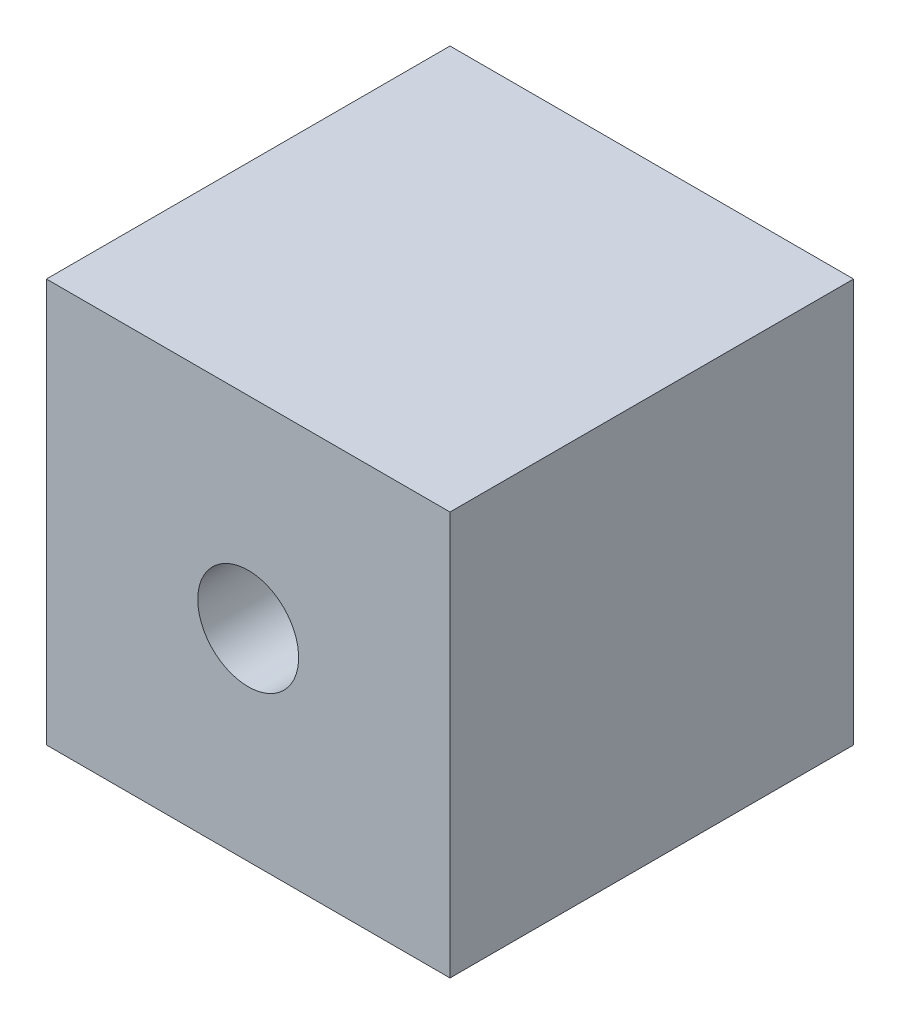
ISO-10303-21;
HEADER;
FILE_DESCRIPTION(('STEP AP214'),'2;1');
FILE_NAME('part.step','',(''),(''),'','','');
FILE_SCHEMA(('AUTOMOTIVE_DESIGN { 1 0 10303 214 1 1 1 1 }'));
ENDSEC;
DATA;
#1=APPLICATION_CONTEXT('core data for automotive mechanical design processes');
#2=APPLICATION_PROTOCOL_DEFINITION('international standard','automotive_design',2000,#1);
#3=PRODUCT_CONTEXT('',#1,'mechanical');
#4=PRODUCT('Part','Part','',(#3));
#5=PRODUCT_RELATED_PRODUCT_CATEGORY('part','',(#4));
#6=PRODUCT_DEFINITION_FORMATION('','',#4);
#7=PRODUCT_DEFINITION_CONTEXT('part definition',#1,'design');
#8=PRODUCT_DEFINITION('design','',#6,#7);
#9=PRODUCT_DEFINITION_SHAPE('','',#8);
#10=(LENGTH_UNIT() NAMED_UNIT(*) SI_UNIT(.MILLI.,.METRE.));
#11=(NAMED_UNIT(*) PLANE_ANGLE_UNIT() SI_UNIT($,.RADIAN.));
#12=(NAMED_UNIT(*) SI_UNIT($,.STERADIAN.) SOLID_ANGLE_UNIT());
#13=UNCERTAINTY_MEASURE_WITH_UNIT(LENGTH_MEASURE(1.E-05),#10,'distance_accuracy_value','');
#14=(GEOMETRIC_REPRESENTATION_CONTEXT(3) GLOBAL_UNCERTAINTY_ASSIGNED_CONTEXT((#13)) GLOBAL_UNIT_ASSIGNED_CONTEXT((#10,
#11,#12)) REPRESENTATION_CONTEXT('',''));
#15=CARTESIAN_POINT('',(0.,0.,0.));
#16=DIRECTION('',(0.,0.,1.));
#17=DIRECTION('',(1.,0.,0.));
#18=AXIS2_PLACEMENT_3D('',#15,#16,#17);
#19=CARTESIAN_POINT('',(30.,30.,30.));
#20=DIRECTION('',(-1.,0.,0.));
#21=DIRECTION('',(0.,-1.,0.));
#22=AXIS2_PLACEMENT_3D('',#19,#20,#21);
#23=PLANE('',#22);
#24=DIRECTION('',(0.,1.,0.));
#25=VECTOR('',#24,1.);
#26=CARTESIAN_POINT('',(30.,30.,-30.));
#27=LINE('',#26,#25);
#28=CARTESIAN_POINT('',(30.,-30.,-30.));
#29=VERTEX_POINT('',#28);
#30=CARTESIAN_POINT('',(30.,30.,-30.));
#31=VERTEX_POINT('',#30);
#32=EDGE_CURVE('E98',#29,#31,#27,.T.);
#33=ORIENTED_EDGE('',*,*,#32,.T.);
#34=DIRECTION('',(0.,0.,-1.));
#35=VECTOR('',#34,1.);
#36=CARTESIAN_POINT('',(30.,30.,30.));
#37=LINE('',#36,#35);
#38=CARTESIAN_POINT('',(30.,30.,30.));
#39=VERTEX_POINT('',#38);
#40=EDGE_CURVE('E11',#39,#31,#37,.T.);
#41=ORIENTED_EDGE('',*,*,#40,.F.);
#42=DIRECTION('',(0.,1.,0.));
#43=VECTOR('',#42,1.);
#44=CARTESIAN_POINT('',(30.,30.,30.));
#45=LINE('',#44,#43);
#46=CARTESIAN_POINT('',(30.,-30.,30.));
#47=VERTEX_POINT('',#46);
#48=EDGE_CURVE('E86',#47,#39,#45,.T.);
#49=ORIENTED_EDGE('',*,*,#48,.F.);
#50=DIRECTION('',(0.,0.,-1.));
#51=VECTOR('',#50,1.);
#52=CARTESIAN_POINT('',(30.,-30.,30.));
#53=LINE('',#52,#51);
#54=EDGE_CURVE('E94',#47,#29,#53,.T.);
#55=ORIENTED_EDGE('',*,*,#54,.T.);
#56=EDGE_LOOP('',(#33,#41,#49,#55));
#57=FACE_BOUND('',#56,.T.);
#58=ADVANCED_FACE('F35',(#57),#23,.F.);
#59=CARTESIAN_POINT('',(-30.,30.,30.));
#60=DIRECTION('',(0.,-1.,0.));
#61=DIRECTION('',(0.,0.,-1.));
#62=AXIS2_PLACEMENT_3D('',#59,#60,#61);
#63=PLANE('',#62);
#64=DIRECTION('',(-1.,0.,0.));
#65=VECTOR('',#64,1.);
#66=CARTESIAN_POINT('',(-30.,30.,-30.));
#67=LINE('',#66,#65);
#68=CARTESIAN_POINT('',(-30.,30.,-30.));
#69=VERTEX_POINT('',#68);
#70=EDGE_CURVE('E90',#31,#69,#67,.T.);
#71=ORIENTED_EDGE('',*,*,#70,.T.);
#72=DIRECTION('',(0.,0.,-1.));
#73=VECTOR('',#72,1.);
#74=CARTESIAN_POINT('',(-30.,30.,30.));
#75=LINE('',#74,#73);
#76=CARTESIAN_POINT('',(-30.,30.,30.));
#77=VERTEX_POINT('',#76);
#78=EDGE_CURVE('E43',#77,#69,#75,.T.);
#79=ORIENTED_EDGE('',*,*,#78,.F.);
#80=DIRECTION('',(-1.,0.,0.));
#81=VECTOR('',#80,1.);
#82=CARTESIAN_POINT('',(-30.,30.,30.));
#83=LINE('',#82,#81);
#84=EDGE_CURVE('E81',#39,#77,#83,.T.);
#85=ORIENTED_EDGE('',*,*,#84,.F.);
#86=ORIENTED_EDGE('',*,*,#40,.T.);
#87=EDGE_LOOP('',(#71,#79,#85,#86));
#88=FACE_BOUND('',#87,.T.);
#89=ADVANCED_FACE('F89',(#88),#63,.F.);
#90=CARTESIAN_POINT('',(-30.,30.,30.));
#91=DIRECTION('',(1.,0.,0.));
#92=DIRECTION('',(0.,1.,0.));
#93=AXIS2_PLACEMENT_3D('',#90,#91,#92);
#94=PLANE('',#93);
#95=DIRECTION('',(0.,-1.,0.));
#96=VECTOR('',#95,1.);
#97=CARTESIAN_POINT('',(-30.,30.,-30.));
#98=LINE('',#97,#96);
#99=CARTESIAN_POINT('',(-30.,-30.,-30.));
#100=VERTEX_POINT('',#99);
#101=EDGE_CURVE('E68',#69,#100,#98,.T.);
#102=ORIENTED_EDGE('',*,*,#101,.T.);
#103=DIRECTION('',(0.,0.,-1.));
#104=VECTOR('',#103,1.);
#105=CARTESIAN_POINT('',(-30.,-30.,30.));
#106=LINE('',#105,#104);
#107=CARTESIAN_POINT('',(-30.,-30.,30.));
#108=VERTEX_POINT('',#107);
#109=EDGE_CURVE('E91',#108,#100,#106,.T.);
#110=ORIENTED_EDGE('',*,*,#109,.F.);
#111=DIRECTION('',(0.,-1.,0.));
#112=VECTOR('',#111,1.);
#113=CARTESIAN_POINT('',(-30.,30.,30.));
#114=LINE('',#113,#112);
#115=EDGE_CURVE('E84',#77,#108,#114,.T.);
#116=ORIENTED_EDGE('',*,*,#115,.F.);
#117=ORIENTED_EDGE('',*,*,#78,.T.);
#118=EDGE_LOOP('',(#102,#110,#116,#117));
#119=FACE_BOUND('',#118,.T.);
#120=ADVANCED_FACE('F92',(#119),#94,.F.);
#121=CARTESIAN_POINT('',(-30.,-30.,30.));
#122=DIRECTION('',(0.,1.,0.));
#123=DIRECTION('',(0.,0.,1.));
#124=AXIS2_PLACEMENT_3D('',#121,#122,#123);
#125=PLANE('',#124);
#126=DIRECTION('',(1.,0.,0.));
#127=VECTOR('',#126,1.);
#128=CARTESIAN_POINT('',(-30.,-30.,-30.));
#129=LINE('',#128,#127);
#130=EDGE_CURVE('E74',#100,#29,#129,.T.);
#131=ORIENTED_EDGE('',*,*,#130,.T.);
#132=ORIENTED_EDGE('',*,*,#54,.F.);
#133=DIRECTION('',(1.,0.,0.));
#134=VECTOR('',#133,1.);
#135=CARTESIAN_POINT('',(-30.,-30.,30.));
#136=LINE('',#135,#134);
#137=EDGE_CURVE('E51',#108,#47,#136,.T.);
#138=ORIENTED_EDGE('',*,*,#137,.F.);
#139=ORIENTED_EDGE('',*,*,#109,.T.);
#140=EDGE_LOOP('',(#131,#132,#138,#139));
#141=FACE_BOUND('',#140,.T.);
#142=ADVANCED_FACE('F106',(#141),#125,.F.);
#143=CARTESIAN_POINT('',(0.,0.,30.));
#144=DIRECTION('',(0.,0.,1.));
#145=DIRECTION('',(1.,0.,0.));
#146=AXIS2_PLACEMENT_3D('',#143,#144,#145);
#147=PLANE('',#146);
#148=CARTESIAN_POINT('',(0.,0.,30.));
#149=DIRECTION('',(0.,0.,-1.));
#150=DIRECTION('',(-1.,0.,0.));
#151=AXIS2_PLACEMENT_3D('',#148,#149,#150);
#152=CIRCLE('',#151,7.5);
#153=CARTESIAN_POINT('',(-7.5,0.,30.));
#154=VERTEX_POINT('',#153);
#155=EDGE_CURVE('E112',#154,#154,#152,.T.);
#156=ORIENTED_EDGE('',*,*,#155,.T.);
#157=EDGE_LOOP('',(#156));
#158=FACE_BOUND('',#157,.T.);
#159=ORIENTED_EDGE('',*,*,#48,.T.);
#160=ORIENTED_EDGE('',*,*,#84,.T.);
#161=ORIENTED_EDGE('',*,*,#115,.T.);
#162=ORIENTED_EDGE('',*,*,#137,.T.);
#163=EDGE_LOOP('',(#159,#160,#161,#162));
#164=FACE_BOUND('',#163,.T.);
#165=ADVANCED_FACE('F82',(#158,#164),#147,.T.);
#166=CARTESIAN_POINT('',(0.,0.,-30.));
#167=DIRECTION('',(0.,0.,1.));
#168=DIRECTION('',(1.,0.,0.));
#169=AXIS2_PLACEMENT_3D('',#166,#167,#168);
#170=PLANE('',#169);
#171=CARTESIAN_POINT('',(0.,0.,-30.));
#172=DIRECTION('',(0.,0.,-1.));
#173=DIRECTION('',(-1.,0.,0.));
#174=AXIS2_PLACEMENT_3D('',#171,#172,#173);
#175=CIRCLE('',#174,7.5);
#176=CARTESIAN_POINT('',(-7.5,0.,-30.));
#177=VERTEX_POINT('',#176);
#178=EDGE_CURVE('E101',#177,#177,#175,.T.);
#179=ORIENTED_EDGE('',*,*,#178,.F.);
#180=EDGE_LOOP('',(#179));
#181=FACE_BOUND('',#180,.T.);
#182=ORIENTED_EDGE('',*,*,#32,.F.);
#183=ORIENTED_EDGE('',*,*,#130,.F.);
#184=ORIENTED_EDGE('',*,*,#101,.F.);
#185=ORIENTED_EDGE('',*,*,#70,.F.);
#186=EDGE_LOOP('',(#182,#183,#184,#185));
#187=FACE_BOUND('',#186,.T.);
#188=ADVANCED_FACE('F109',(#181,#187),#170,.F.);
#189=CARTESIAN_POINT('',(0.,0.,-30.));
#190=DIRECTION('',(0.,0.,1.));
#191=DIRECTION('',(1.,0.,0.));
#192=AXIS2_PLACEMENT_3D('',#189,#190,#191);
#193=CYLINDRICAL_SURFACE('',#192,7.5);
#194=ORIENTED_EDGE('',*,*,#178,.T.);
#195=EDGE_LOOP('',(#194));
#196=FACE_BOUND('',#195,.T.);
#197=ORIENTED_EDGE('',*,*,#155,.F.);
#198=EDGE_LOOP('',(#197));
#199=FACE_BOUND('',#198,.T.);
#200=ADVANCED_FACE('F118',(#196,#199),#193,.F.);
#201=CLOSED_SHELL('',(#58,#89,#120,#142,#165,#188,#200));
#202=MANIFOLD_SOLID_BREP('B2',#201);
#203=ADVANCED_BREP_SHAPE_REPRESENTATION('',(#18,#202),#14);
#204=SHAPE_DEFINITION_REPRESENTATION(#9,#203);
ENDSEC;
END-ISO-10303-21;
